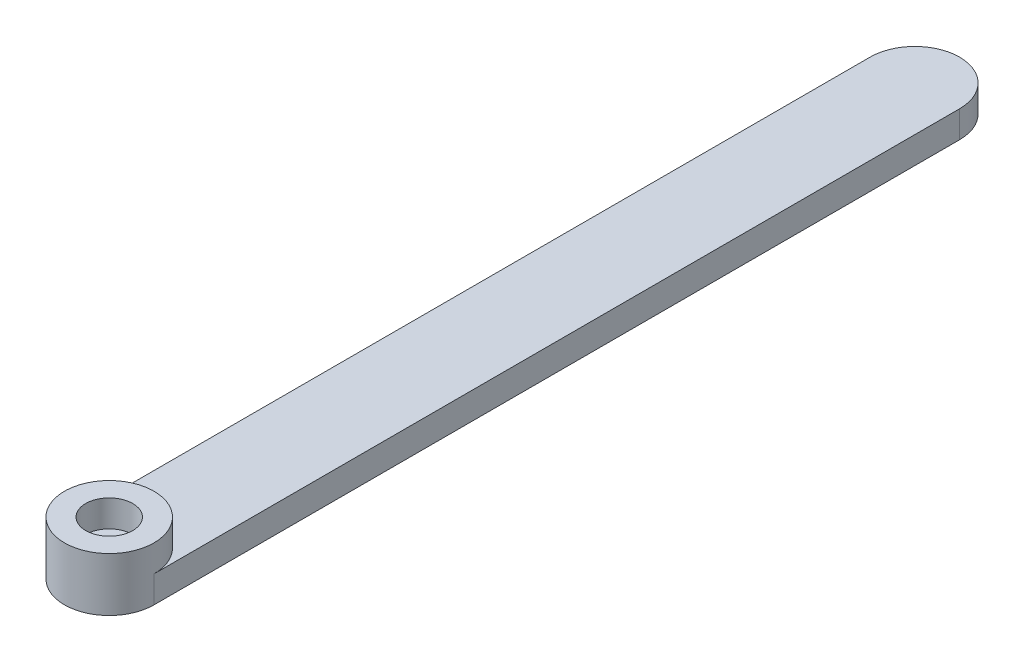
ISO-10303-21;
HEADER;
FILE_DESCRIPTION(('STEP AP214'),'2;1');
FILE_NAME('part.step','',(''),(''),'','','');
FILE_SCHEMA(('AUTOMOTIVE_DESIGN { 1 0 10303 214 1 1 1 1 }'));
ENDSEC;
DATA;
#1=APPLICATION_CONTEXT('core data for automotive mechanical design processes');
#2=APPLICATION_PROTOCOL_DEFINITION('international standard','automotive_design',2000,#1);
#3=PRODUCT_CONTEXT('',#1,'mechanical');
#4=PRODUCT('Part','Part','',(#3));
#5=PRODUCT_RELATED_PRODUCT_CATEGORY('part','',(#4));
#6=PRODUCT_DEFINITION_FORMATION('','',#4);
#7=PRODUCT_DEFINITION_CONTEXT('part definition',#1,'design');
#8=PRODUCT_DEFINITION('design','',#6,#7);
#9=PRODUCT_DEFINITION_SHAPE('','',#8);
#10=(LENGTH_UNIT() NAMED_UNIT(*) SI_UNIT(.MILLI.,.METRE.));
#11=(NAMED_UNIT(*) PLANE_ANGLE_UNIT() SI_UNIT($,.RADIAN.));
#12=(NAMED_UNIT(*) SI_UNIT($,.STERADIAN.) SOLID_ANGLE_UNIT());
#13=UNCERTAINTY_MEASURE_WITH_UNIT(LENGTH_MEASURE(1.E-05),#10,'distance_accuracy_value','');
#14=(GEOMETRIC_REPRESENTATION_CONTEXT(3) GLOBAL_UNCERTAINTY_ASSIGNED_CONTEXT((#13)) GLOBAL_UNIT_ASSIGNED_CONTEXT((#10,
#11,#12)) REPRESENTATION_CONTEXT('',''));
#15=CARTESIAN_POINT('',(0.,0.,0.));
#16=DIRECTION('',(0.,0.,1.));
#17=DIRECTION('',(1.,0.,0.));
#18=AXIS2_PLACEMENT_3D('',#15,#16,#17);
#19=CARTESIAN_POINT('',(0.,3.,0.));
#20=DIRECTION('',(0.,1.,0.));
#21=DIRECTION('',(0.,0.,1.));
#22=AXIS2_PLACEMENT_3D('',#19,#20,#21);
#23=PLANE('',#22);
#24=CARTESIAN_POINT('',(0.,3.,0.));
#25=DIRECTION('',(0.,1.,0.));
#26=DIRECTION('',(0.,0.,1.));
#27=AXIS2_PLACEMENT_3D('',#24,#25,#26);
#28=CIRCLE('',#27,1.15);
#29=CARTESIAN_POINT('',(0.,3.,1.15));
#30=VERTEX_POINT('',#29);
#31=EDGE_CURVE('E111',#30,#30,#28,.T.);
#32=ORIENTED_EDGE('',*,*,#31,.F.);
#33=EDGE_LOOP('',(#32));
#34=FACE_BOUND('',#33,.T.);
#35=CARTESIAN_POINT('',(0.,3.,0.));
#36=DIRECTION('',(0.,1.,0.));
#37=DIRECTION('',(0.,0.,1.));
#38=AXIS2_PLACEMENT_3D('',#35,#36,#37);
#39=CIRCLE('',#38,2.625);
#40=CARTESIAN_POINT('',(0.,3.,2.625));
#41=VERTEX_POINT('',#40);
#42=EDGE_CURVE('E107',#41,#41,#39,.T.);
#43=ORIENTED_EDGE('',*,*,#42,.T.);
#44=EDGE_LOOP('',(#43));
#45=FACE_BOUND('',#44,.T.);
#46=ADVANCED_FACE('F39',(#34,#45),#23,.T.);
#47=CARTESIAN_POINT('',(0.,3.,0.));
#48=DIRECTION('',(0.,1.,0.));
#49=DIRECTION('',(0.,0.,1.));
#50=AXIS2_PLACEMENT_3D('',#47,#48,#49);
#51=CIRCLE('',#50,5.);
#52=CARTESIAN_POINT('',(5.,3.,0.));
#53=VERTEX_POINT('',#52);
#54=CARTESIAN_POINT('',(-5.,3.,0.));
#55=VERTEX_POINT('',#54);
#56=EDGE_CURVE('E91',#53,#55,#51,.T.);
#57=ORIENTED_EDGE('',*,*,#56,.F.);
#58=DIRECTION('',(0.,0.,-1.));
#59=VECTOR('',#58,1.);
#60=CARTESIAN_POINT('',(5.,3.,0.));
#61=LINE('',#60,#59);
#62=CARTESIAN_POINT('',(5.,3.,-90.));
#63=VERTEX_POINT('',#62);
#64=EDGE_CURVE('E83',#53,#63,#61,.T.);
#65=ORIENTED_EDGE('',*,*,#64,.T.);
#66=CARTESIAN_POINT('',(0.,3.,-90.));
#67=DIRECTION('',(0.,1.,0.));
#68=DIRECTION('',(0.,0.,1.));
#69=AXIS2_PLACEMENT_3D('',#66,#67,#68);
#70=CIRCLE('',#69,5.);
#71=CARTESIAN_POINT('',(-5.,3.,-90.));
#72=VERTEX_POINT('',#71);
#73=EDGE_CURVE('E97',#63,#72,#70,.T.);
#74=ORIENTED_EDGE('',*,*,#73,.T.);
#75=DIRECTION('',(0.,0.,1.));
#76=VECTOR('',#75,1.);
#77=CARTESIAN_POINT('',(-5.,3.,0.));
#78=LINE('',#77,#76);
#79=EDGE_CURVE('E56',#72,#55,#78,.T.);
#80=ORIENTED_EDGE('',*,*,#79,.T.);
#81=EDGE_LOOP('',(#57,#65,#74,#80));
#82=FACE_BOUND('',#81,.T.);
#83=ADVANCED_FACE('F99',(#82),#23,.T.);
#84=CARTESIAN_POINT('',(0.,0.,0.));
#85=DIRECTION('',(0.,1.,0.));
#86=DIRECTION('',(0.,0.,1.));
#87=AXIS2_PLACEMENT_3D('',#84,#85,#86);
#88=PLANE('',#87);
#89=CARTESIAN_POINT('',(0.,0.,0.));
#90=DIRECTION('',(0.,1.,0.));
#91=DIRECTION('',(0.,0.,1.));
#92=AXIS2_PLACEMENT_3D('',#89,#90,#91);
#93=CIRCLE('',#92,5.);
#94=CARTESIAN_POINT('',(-5.,0.,0.));
#95=VERTEX_POINT('',#94);
#96=CARTESIAN_POINT('',(5.,0.,0.));
#97=VERTEX_POINT('',#96);
#98=EDGE_CURVE('E93',#95,#97,#93,.T.);
#99=ORIENTED_EDGE('',*,*,#98,.F.);
#100=DIRECTION('',(0.,0.,1.));
#101=VECTOR('',#100,1.);
#102=CARTESIAN_POINT('',(-5.,0.,0.));
#103=LINE('',#102,#101);
#104=CARTESIAN_POINT('',(-5.,0.,-90.));
#105=VERTEX_POINT('',#104);
#106=EDGE_CURVE('E79',#105,#95,#103,.T.);
#107=ORIENTED_EDGE('',*,*,#106,.F.);
#108=CARTESIAN_POINT('',(0.,0.,-90.));
#109=DIRECTION('',(0.,1.,0.));
#110=DIRECTION('',(0.,0.,1.));
#111=AXIS2_PLACEMENT_3D('',#108,#109,#110);
#112=CIRCLE('',#111,5.);
#113=CARTESIAN_POINT('',(5.,0.,-90.));
#114=VERTEX_POINT('',#113);
#115=EDGE_CURVE('E74',#114,#105,#112,.T.);
#116=ORIENTED_EDGE('',*,*,#115,.F.);
#117=DIRECTION('',(0.,0.,-1.));
#118=VECTOR('',#117,1.);
#119=CARTESIAN_POINT('',(5.,0.,0.));
#120=LINE('',#119,#118);
#121=EDGE_CURVE('E120',#97,#114,#120,.T.);
#122=ORIENTED_EDGE('',*,*,#121,.F.);
#123=EDGE_LOOP('',(#99,#107,#116,#122));
#124=FACE_BOUND('',#123,.T.);
#125=CARTESIAN_POINT('',(0.,0.,0.));
#126=DIRECTION('',(0.,1.,0.));
#127=DIRECTION('',(0.,0.,1.));
#128=AXIS2_PLACEMENT_3D('',#125,#126,#127);
#129=CIRCLE('',#128,1.15);
#130=CARTESIAN_POINT('',(0.,0.,1.15));
#131=VERTEX_POINT('',#130);
#132=EDGE_CURVE('E104',#131,#131,#129,.T.);
#133=ORIENTED_EDGE('',*,*,#132,.T.);
#134=EDGE_LOOP('',(#133));
#135=FACE_BOUND('',#134,.T.);
#136=ADVANCED_FACE('F128',(#124,#135),#88,.F.);
#137=CARTESIAN_POINT('',(0.,3.,0.));
#138=DIRECTION('',(0.,-1.,0.));
#139=DIRECTION('',(0.,0.,-1.));
#140=AXIS2_PLACEMENT_3D('',#137,#138,#139);
#141=CYLINDRICAL_SURFACE('',#140,5.);
#142=ORIENTED_EDGE('',*,*,#98,.T.);
#143=DIRECTION('',(0.,-1.,0.));
#144=VECTOR('',#143,1.);
#145=CARTESIAN_POINT('',(5.,3.,0.));
#146=LINE('',#145,#144);
#147=EDGE_CURVE('E11',#53,#97,#146,.T.);
#148=ORIENTED_EDGE('',*,*,#147,.F.);
#149=ORIENTED_EDGE('',*,*,#56,.T.);
#150=DIRECTION('',(0.,-1.,0.));
#151=VECTOR('',#150,1.);
#152=CARTESIAN_POINT('',(-5.,3.,0.));
#153=LINE('',#152,#151);
#154=EDGE_CURVE('E118',#55,#95,#153,.T.);
#155=ORIENTED_EDGE('',*,*,#154,.T.);
#156=EDGE_LOOP('',(#142,#148,#149,#155));
#157=FACE_BOUND('',#156,.T.);
#158=CARTESIAN_POINT('',(0.,6.,0.));
#159=DIRECTION('',(0.,1.,0.));
#160=DIRECTION('',(0.,0.,1.));
#161=AXIS2_PLACEMENT_3D('',#158,#159,#160);
#162=CIRCLE('',#161,5.);
#163=CARTESIAN_POINT('',(0.,6.,5.));
#164=VERTEX_POINT('',#163);
#165=EDGE_CURVE('E100',#164,#164,#162,.T.);
#166=ORIENTED_EDGE('',*,*,#165,.F.);
#167=EDGE_LOOP('',(#166));
#168=FACE_BOUND('',#167,.T.);
#169=ADVANCED_FACE('F41',(#157,#168),#141,.T.);
#170=CARTESIAN_POINT('',(5.,3.,0.));
#171=DIRECTION('',(-1.,0.,0.));
#172=DIRECTION('',(0.,0.,1.));
#173=AXIS2_PLACEMENT_3D('',#170,#171,#172);
#174=PLANE('',#173);
#175=ORIENTED_EDGE('',*,*,#121,.T.);
#176=DIRECTION('',(0.,-1.,0.));
#177=VECTOR('',#176,1.);
#178=CARTESIAN_POINT('',(5.,3.,-90.));
#179=LINE('',#178,#177);
#180=EDGE_CURVE('E48',#63,#114,#179,.T.);
#181=ORIENTED_EDGE('',*,*,#180,.F.);
#182=ORIENTED_EDGE('',*,*,#64,.F.);
#183=ORIENTED_EDGE('',*,*,#147,.T.);
#184=EDGE_LOOP('',(#175,#181,#182,#183));
#185=FACE_BOUND('',#184,.T.);
#186=ADVANCED_FACE('F95',(#185),#174,.F.);
#187=CARTESIAN_POINT('',(0.,3.,-90.));
#188=DIRECTION('',(0.,-1.,0.));
#189=DIRECTION('',(0.,0.,-1.));
#190=AXIS2_PLACEMENT_3D('',#187,#188,#189);
#191=CYLINDRICAL_SURFACE('',#190,5.);
#192=ORIENTED_EDGE('',*,*,#115,.T.);
#193=DIRECTION('',(0.,-1.,0.));
#194=VECTOR('',#193,1.);
#195=CARTESIAN_POINT('',(-5.,3.,-90.));
#196=LINE('',#195,#194);
#197=EDGE_CURVE('E125',#72,#105,#196,.T.);
#198=ORIENTED_EDGE('',*,*,#197,.F.);
#199=ORIENTED_EDGE('',*,*,#73,.F.);
#200=ORIENTED_EDGE('',*,*,#180,.T.);
#201=EDGE_LOOP('',(#192,#198,#199,#200));
#202=FACE_BOUND('',#201,.T.);
#203=ADVANCED_FACE('F126',(#202),#191,.T.);
#204=CARTESIAN_POINT('',(-5.,3.,0.));
#205=DIRECTION('',(1.,0.,0.));
#206=DIRECTION('',(0.,0.,-1.));
#207=AXIS2_PLACEMENT_3D('',#204,#205,#206);
#208=PLANE('',#207);
#209=ORIENTED_EDGE('',*,*,#106,.T.);
#210=ORIENTED_EDGE('',*,*,#154,.F.);
#211=ORIENTED_EDGE('',*,*,#79,.F.);
#212=ORIENTED_EDGE('',*,*,#197,.T.);
#213=EDGE_LOOP('',(#209,#210,#211,#212));
#214=FACE_BOUND('',#213,.T.);
#215=ADVANCED_FACE('F137',(#214),#208,.F.);
#216=CARTESIAN_POINT('',(0.,3.,0.));
#217=DIRECTION('',(0.,-1.,0.));
#218=DIRECTION('',(0.,0.,-1.));
#219=AXIS2_PLACEMENT_3D('',#216,#217,#218);
#220=CYLINDRICAL_SURFACE('',#219,1.15);
#221=ORIENTED_EDGE('',*,*,#31,.T.);
#222=EDGE_LOOP('',(#221));
#223=FACE_BOUND('',#222,.T.);
#224=ORIENTED_EDGE('',*,*,#132,.F.);
#225=EDGE_LOOP('',(#224));
#226=FACE_BOUND('',#225,.T.);
#227=ADVANCED_FACE('F134',(#223,#226),#220,.F.);
#228=CARTESIAN_POINT('',(0.,6.,0.));
#229=DIRECTION('',(0.,1.,0.));
#230=DIRECTION('',(0.,0.,1.));
#231=AXIS2_PLACEMENT_3D('',#228,#229,#230);
#232=PLANE('',#231);
#233=ORIENTED_EDGE('',*,*,#165,.T.);
#234=EDGE_LOOP('',(#233));
#235=FACE_BOUND('',#234,.T.);
#236=CARTESIAN_POINT('',(0.,6.,0.));
#237=DIRECTION('',(0.,1.,0.));
#238=DIRECTION('',(0.,0.,1.));
#239=AXIS2_PLACEMENT_3D('',#236,#237,#238);
#240=CIRCLE('',#239,2.625);
#241=CARTESIAN_POINT('',(0.,6.,2.625));
#242=VERTEX_POINT('',#241);
#243=EDGE_CURVE('E101',#242,#242,#240,.T.);
#244=ORIENTED_EDGE('',*,*,#243,.F.);
#245=EDGE_LOOP('',(#244));
#246=FACE_BOUND('',#245,.T.);
#247=ADVANCED_FACE('F136',(#235,#246),#232,.T.);
#248=CARTESIAN_POINT('',(0.,6.,0.));
#249=DIRECTION('',(0.,-1.,0.));
#250=DIRECTION('',(0.,0.,-1.));
#251=AXIS2_PLACEMENT_3D('',#248,#249,#250);
#252=CYLINDRICAL_SURFACE('',#251,2.625);
#253=ORIENTED_EDGE('',*,*,#243,.T.);
#254=EDGE_LOOP('',(#253));
#255=FACE_BOUND('',#254,.T.);
#256=ORIENTED_EDGE('',*,*,#42,.F.);
#257=EDGE_LOOP('',(#256));
#258=FACE_BOUND('',#257,.T.);
#259=ADVANCED_FACE('F145',(#255,#258),#252,.F.);
#260=CLOSED_SHELL('',(#46,#83,#136,#169,#186,#203,#215,#227,#247,#259));
#261=MANIFOLD_SOLID_BREP('B2',#260);
#262=ADVANCED_BREP_SHAPE_REPRESENTATION('',(#18,#261),#14);
#263=SHAPE_DEFINITION_REPRESENTATION(#9,#262);
ENDSEC;
END-ISO-10303-21;
